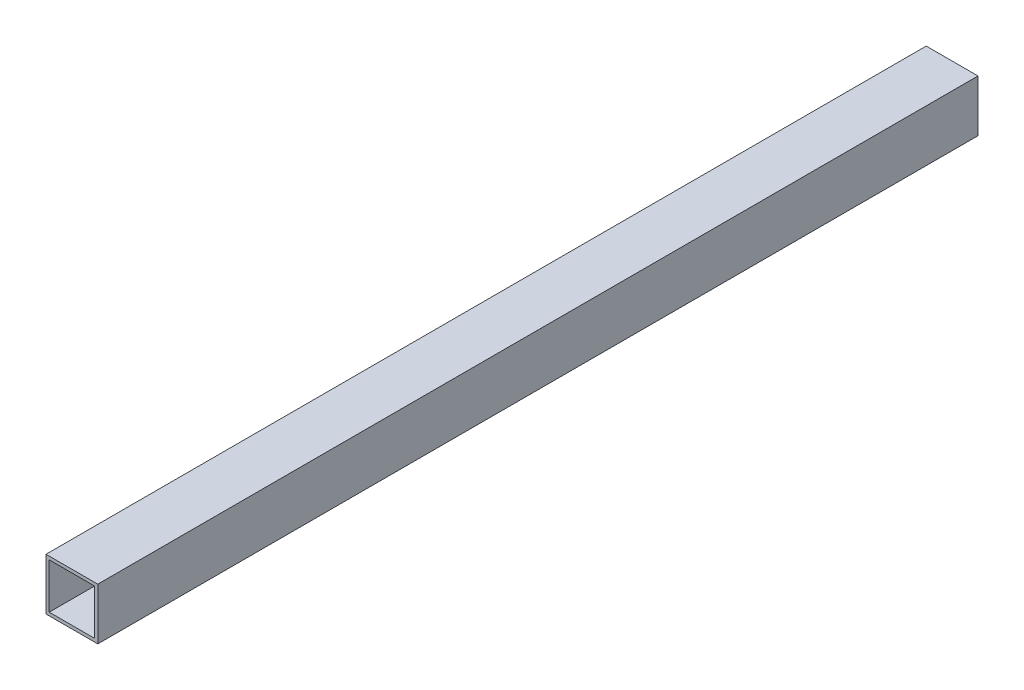
ISO-10303-21;
HEADER;
FILE_DESCRIPTION(('STEP AP214'),'2;1');
FILE_NAME('part.step','',(''),(''),'','','');
FILE_SCHEMA(('AUTOMOTIVE_DESIGN { 1 0 10303 214 1 1 1 1 }'));
ENDSEC;
DATA;
#1=APPLICATION_CONTEXT('core data for automotive mechanical design processes');
#2=APPLICATION_PROTOCOL_DEFINITION('international standard','automotive_design',2000,#1);
#3=PRODUCT_CONTEXT('',#1,'mechanical');
#4=PRODUCT('Part','Part','',(#3));
#5=PRODUCT_RELATED_PRODUCT_CATEGORY('part','',(#4));
#6=PRODUCT_DEFINITION_FORMATION('','',#4);
#7=PRODUCT_DEFINITION_CONTEXT('part definition',#1,'design');
#8=PRODUCT_DEFINITION('design','',#6,#7);
#9=PRODUCT_DEFINITION_SHAPE('','',#8);
#10=(LENGTH_UNIT() NAMED_UNIT(*) SI_UNIT(.MILLI.,.METRE.));
#11=(NAMED_UNIT(*) PLANE_ANGLE_UNIT() SI_UNIT($,.RADIAN.));
#12=(NAMED_UNIT(*) SI_UNIT($,.STERADIAN.) SOLID_ANGLE_UNIT());
#13=UNCERTAINTY_MEASURE_WITH_UNIT(LENGTH_MEASURE(1.E-05),#10,'distance_accuracy_value','');
#14=(GEOMETRIC_REPRESENTATION_CONTEXT(3) GLOBAL_UNCERTAINTY_ASSIGNED_CONTEXT((#13)) GLOBAL_UNIT_ASSIGNED_CONTEXT((#10,
#11,#12)) REPRESENTATION_CONTEXT('',''));
#15=CARTESIAN_POINT('',(0.,0.,0.));
#16=DIRECTION('',(0.,0.,1.));
#17=DIRECTION('',(1.,0.,0.));
#18=AXIS2_PLACEMENT_3D('',#15,#16,#17);
#19=CARTESIAN_POINT('',(25.4,25.4,863.6));
#20=DIRECTION('',(0.,0.,-1.));
#21=DIRECTION('',(-1.,0.,0.));
#22=AXIS2_PLACEMENT_3D('',#19,#20,#21);
#23=PLANE('',#22);
#24=DIRECTION('',(0.,1.,0.));
#25=VECTOR('',#24,1.);
#26=CARTESIAN_POINT('',(25.4,-25.4,863.6));
#27=LINE('',#26,#25);
#28=CARTESIAN_POINT('',(25.4,-25.4,863.6));
#29=VERTEX_POINT('',#28);
#30=CARTESIAN_POINT('',(25.4,25.4,863.6));
#31=VERTEX_POINT('',#30);
#32=EDGE_CURVE('E130',#29,#31,#27,.T.);
#33=ORIENTED_EDGE('',*,*,#32,.T.);
#34=DIRECTION('',(-1.,0.,0.));
#35=VECTOR('',#34,1.);
#36=CARTESIAN_POINT('',(-25.4,25.4,863.6));
#37=LINE('',#36,#35);
#38=CARTESIAN_POINT('',(-25.4,25.4,863.6));
#39=VERTEX_POINT('',#38);
#40=EDGE_CURVE('E133',#31,#39,#37,.T.);
#41=ORIENTED_EDGE('',*,*,#40,.T.);
#42=DIRECTION('',(0.,-1.,0.));
#43=VECTOR('',#42,1.);
#44=CARTESIAN_POINT('',(-25.4,-25.4,863.6));
#45=LINE('',#44,#43);
#46=CARTESIAN_POINT('',(-25.4,-25.4,863.6));
#47=VERTEX_POINT('',#46);
#48=EDGE_CURVE('E136',#39,#47,#45,.T.);
#49=ORIENTED_EDGE('',*,*,#48,.T.);
#50=DIRECTION('',(1.,0.,0.));
#51=VECTOR('',#50,1.);
#52=CARTESIAN_POINT('',(-25.4,-25.4,863.6));
#53=LINE('',#52,#51);
#54=EDGE_CURVE('E138',#47,#29,#53,.T.);
#55=ORIENTED_EDGE('',*,*,#54,.T.);
#56=EDGE_LOOP('',(#33,#41,#49,#55));
#57=FACE_BOUND('',#56,.T.);
#58=DIRECTION('',(0.,1.,0.));
#59=VECTOR('',#58,1.);
#60=CARTESIAN_POINT('',(22.225,25.4,863.6));
#61=LINE('',#60,#59);
#62=CARTESIAN_POINT('',(22.225,-22.225,863.6));
#63=VERTEX_POINT('',#62);
#64=CARTESIAN_POINT('',(22.225,22.225,863.6));
#65=VERTEX_POINT('',#64);
#66=EDGE_CURVE('E118',#63,#65,#61,.T.);
#67=ORIENTED_EDGE('',*,*,#66,.F.);
#68=DIRECTION('',(1.,0.,0.));
#69=VECTOR('',#68,1.);
#70=CARTESIAN_POINT('',(25.4,-22.225,863.6));
#71=LINE('',#70,#69);
#72=CARTESIAN_POINT('',(-22.225,-22.225,863.6));
#73=VERTEX_POINT('',#72);
#74=EDGE_CURVE('E103',#73,#63,#71,.T.);
#75=ORIENTED_EDGE('',*,*,#74,.F.);
#76=DIRECTION('',(0.,-1.,0.));
#77=VECTOR('',#76,1.);
#78=CARTESIAN_POINT('',(-22.225,25.4,863.6));
#79=LINE('',#78,#77);
#80=CARTESIAN_POINT('',(-22.225,22.225,863.6));
#81=VERTEX_POINT('',#80);
#82=EDGE_CURVE('E127',#81,#73,#79,.T.);
#83=ORIENTED_EDGE('',*,*,#82,.F.);
#84=DIRECTION('',(-1.,0.,0.));
#85=VECTOR('',#84,1.);
#86=CARTESIAN_POINT('',(25.4,22.225,863.6));
#87=LINE('',#86,#85);
#88=EDGE_CURVE('E120',#65,#81,#87,.T.);
#89=ORIENTED_EDGE('',*,*,#88,.F.);
#90=EDGE_LOOP('',(#67,#75,#83,#89));
#91=FACE_BOUND('',#90,.T.);
#92=ADVANCED_FACE('F33',(#57,#91),#23,.F.);
#93=CARTESIAN_POINT('',(25.4,25.4,0.));
#94=DIRECTION('',(0.,0.,-1.));
#95=DIRECTION('',(-1.,0.,0.));
#96=AXIS2_PLACEMENT_3D('',#93,#94,#95);
#97=PLANE('',#96);
#98=DIRECTION('',(0.,1.,0.));
#99=VECTOR('',#98,1.);
#100=CARTESIAN_POINT('',(25.4,-25.4,0.));
#101=LINE('',#100,#99);
#102=CARTESIAN_POINT('',(25.4,-25.4,0.));
#103=VERTEX_POINT('',#102);
#104=CARTESIAN_POINT('',(25.4,25.4,0.));
#105=VERTEX_POINT('',#104);
#106=EDGE_CURVE('E141',#103,#105,#101,.T.);
#107=ORIENTED_EDGE('',*,*,#106,.F.);
#108=DIRECTION('',(1.,0.,0.));
#109=VECTOR('',#108,1.);
#110=CARTESIAN_POINT('',(-25.4,-25.4,0.));
#111=LINE('',#110,#109);
#112=CARTESIAN_POINT('',(-25.4,-25.4,0.));
#113=VERTEX_POINT('',#112);
#114=EDGE_CURVE('E134',#113,#103,#111,.T.);
#115=ORIENTED_EDGE('',*,*,#114,.F.);
#116=DIRECTION('',(0.,-1.,0.));
#117=VECTOR('',#116,1.);
#118=CARTESIAN_POINT('',(-25.4,-25.4,0.));
#119=LINE('',#118,#117);
#120=CARTESIAN_POINT('',(-25.4,25.4,0.));
#121=VERTEX_POINT('',#120);
#122=EDGE_CURVE('E146',#121,#113,#119,.T.);
#123=ORIENTED_EDGE('',*,*,#122,.F.);
#124=DIRECTION('',(-1.,0.,0.));
#125=VECTOR('',#124,1.);
#126=CARTESIAN_POINT('',(-25.4,25.4,0.));
#127=LINE('',#126,#125);
#128=EDGE_CURVE('E144',#105,#121,#127,.T.);
#129=ORIENTED_EDGE('',*,*,#128,.F.);
#130=EDGE_LOOP('',(#107,#115,#123,#129));
#131=FACE_BOUND('',#130,.T.);
#132=DIRECTION('',(1.,0.,0.));
#133=VECTOR('',#132,1.);
#134=CARTESIAN_POINT('',(25.4,-22.225,0.));
#135=LINE('',#134,#133);
#136=CARTESIAN_POINT('',(-22.225,-22.225,0.));
#137=VERTEX_POINT('',#136);
#138=CARTESIAN_POINT('',(22.225,-22.225,0.));
#139=VERTEX_POINT('',#138);
#140=EDGE_CURVE('E101',#137,#139,#135,.T.);
#141=ORIENTED_EDGE('',*,*,#140,.T.);
#142=DIRECTION('',(0.,1.,0.));
#143=VECTOR('',#142,1.);
#144=CARTESIAN_POINT('',(22.225,25.4,0.));
#145=LINE('',#144,#143);
#146=CARTESIAN_POINT('',(22.225,22.225,0.));
#147=VERTEX_POINT('',#146);
#148=EDGE_CURVE('E109',#139,#147,#145,.T.);
#149=ORIENTED_EDGE('',*,*,#148,.T.);
#150=DIRECTION('',(-1.,0.,0.));
#151=VECTOR('',#150,1.);
#152=CARTESIAN_POINT('',(25.4,22.225,0.));
#153=LINE('',#152,#151);
#154=CARTESIAN_POINT('',(-22.225,22.225,0.));
#155=VERTEX_POINT('',#154);
#156=EDGE_CURVE('E115',#147,#155,#153,.T.);
#157=ORIENTED_EDGE('',*,*,#156,.T.);
#158=DIRECTION('',(0.,-1.,0.));
#159=VECTOR('',#158,1.);
#160=CARTESIAN_POINT('',(-22.225,25.4,0.));
#161=LINE('',#160,#159);
#162=EDGE_CURVE('E55',#155,#137,#161,.T.);
#163=ORIENTED_EDGE('',*,*,#162,.T.);
#164=EDGE_LOOP('',(#141,#149,#157,#163));
#165=FACE_BOUND('',#164,.T.);
#166=ADVANCED_FACE('F117',(#131,#165),#97,.T.);
#167=CARTESIAN_POINT('',(25.4,-25.4,863.6));
#168=DIRECTION('',(-1.,0.,0.));
#169=DIRECTION('',(0.,0.,1.));
#170=AXIS2_PLACEMENT_3D('',#167,#168,#169);
#171=PLANE('',#170);
#172=ORIENTED_EDGE('',*,*,#106,.T.);
#173=DIRECTION('',(0.,0.,-1.));
#174=VECTOR('',#173,1.);
#175=CARTESIAN_POINT('',(25.4,25.4,863.6));
#176=LINE('',#175,#174);
#177=EDGE_CURVE('E11',#31,#105,#176,.T.);
#178=ORIENTED_EDGE('',*,*,#177,.F.);
#179=ORIENTED_EDGE('',*,*,#32,.F.);
#180=DIRECTION('',(0.,0.,-1.));
#181=VECTOR('',#180,1.);
#182=CARTESIAN_POINT('',(25.4,-25.4,863.6));
#183=LINE('',#182,#181);
#184=EDGE_CURVE('E140',#29,#103,#183,.T.);
#185=ORIENTED_EDGE('',*,*,#184,.T.);
#186=EDGE_LOOP('',(#172,#178,#179,#185));
#187=FACE_BOUND('',#186,.T.);
#188=ADVANCED_FACE('F35',(#187),#171,.F.);
#189=CARTESIAN_POINT('',(-25.4,25.4,863.6));
#190=DIRECTION('',(0.,-1.,0.));
#191=DIRECTION('',(0.,0.,-1.));
#192=AXIS2_PLACEMENT_3D('',#189,#190,#191);
#193=PLANE('',#192);
#194=ORIENTED_EDGE('',*,*,#128,.T.);
#195=DIRECTION('',(0.,0.,-1.));
#196=VECTOR('',#195,1.);
#197=CARTESIAN_POINT('',(-25.4,25.4,863.6));
#198=LINE('',#197,#196);
#199=EDGE_CURVE('E41',#39,#121,#198,.T.);
#200=ORIENTED_EDGE('',*,*,#199,.F.);
#201=ORIENTED_EDGE('',*,*,#40,.F.);
#202=ORIENTED_EDGE('',*,*,#177,.T.);
#203=EDGE_LOOP('',(#194,#200,#201,#202));
#204=FACE_BOUND('',#203,.T.);
#205=ADVANCED_FACE('F173',(#204),#193,.F.);
#206=CARTESIAN_POINT('',(-25.4,-25.4,863.6));
#207=DIRECTION('',(1.,0.,0.));
#208=DIRECTION('',(0.,0.,-1.));
#209=AXIS2_PLACEMENT_3D('',#206,#207,#208);
#210=PLANE('',#209);
#211=ORIENTED_EDGE('',*,*,#122,.T.);
#212=DIRECTION('',(0.,0.,-1.));
#213=VECTOR('',#212,1.);
#214=CARTESIAN_POINT('',(-25.4,-25.4,863.6));
#215=LINE('',#214,#213);
#216=EDGE_CURVE('E151',#47,#113,#215,.T.);
#217=ORIENTED_EDGE('',*,*,#216,.F.);
#218=ORIENTED_EDGE('',*,*,#48,.F.);
#219=ORIENTED_EDGE('',*,*,#199,.T.);
#220=EDGE_LOOP('',(#211,#217,#218,#219));
#221=FACE_BOUND('',#220,.T.);
#222=ADVANCED_FACE('F158',(#221),#210,.F.);
#223=CARTESIAN_POINT('',(-25.4,-25.4,863.6));
#224=DIRECTION('',(0.,1.,0.));
#225=DIRECTION('',(0.,0.,1.));
#226=AXIS2_PLACEMENT_3D('',#223,#224,#225);
#227=PLANE('',#226);
#228=ORIENTED_EDGE('',*,*,#114,.T.);
#229=ORIENTED_EDGE('',*,*,#184,.F.);
#230=ORIENTED_EDGE('',*,*,#54,.F.);
#231=ORIENTED_EDGE('',*,*,#216,.T.);
#232=EDGE_LOOP('',(#228,#229,#230,#231));
#233=FACE_BOUND('',#232,.T.);
#234=ADVANCED_FACE('F166',(#233),#227,.F.);
#235=CARTESIAN_POINT('',(22.225,-25.4,863.6));
#236=DIRECTION('',(-1.,0.,0.));
#237=DIRECTION('',(0.,0.,1.));
#238=AXIS2_PLACEMENT_3D('',#235,#236,#237);
#239=PLANE('',#238);
#240=ORIENTED_EDGE('',*,*,#148,.F.);
#241=DIRECTION('',(0.,0.,-1.));
#242=VECTOR('',#241,1.);
#243=CARTESIAN_POINT('',(22.225,-22.225,863.6));
#244=LINE('',#243,#242);
#245=EDGE_CURVE('E97',#63,#139,#244,.T.);
#246=ORIENTED_EDGE('',*,*,#245,.F.);
#247=ORIENTED_EDGE('',*,*,#66,.T.);
#248=DIRECTION('',(0.,0.,-1.));
#249=VECTOR('',#248,1.);
#250=CARTESIAN_POINT('',(22.225,22.225,863.6));
#251=LINE('',#250,#249);
#252=EDGE_CURVE('E112',#65,#147,#251,.T.);
#253=ORIENTED_EDGE('',*,*,#252,.T.);
#254=EDGE_LOOP('',(#240,#246,#247,#253));
#255=FACE_BOUND('',#254,.T.);
#256=ADVANCED_FACE('F110',(#255),#239,.T.);
#257=CARTESIAN_POINT('',(-25.4,22.225,863.6));
#258=DIRECTION('',(0.,-1.,0.));
#259=DIRECTION('',(0.,0.,-1.));
#260=AXIS2_PLACEMENT_3D('',#257,#258,#259);
#261=PLANE('',#260);
#262=ORIENTED_EDGE('',*,*,#156,.F.);
#263=ORIENTED_EDGE('',*,*,#252,.F.);
#264=ORIENTED_EDGE('',*,*,#88,.T.);
#265=DIRECTION('',(0.,0.,-1.));
#266=VECTOR('',#265,1.);
#267=CARTESIAN_POINT('',(-22.225,22.225,863.6));
#268=LINE('',#267,#266);
#269=EDGE_CURVE('E256',#81,#155,#268,.T.);
#270=ORIENTED_EDGE('',*,*,#269,.T.);
#271=EDGE_LOOP('',(#262,#263,#264,#270));
#272=FACE_BOUND('',#271,.T.);
#273=ADVANCED_FACE('F193',(#272),#261,.T.);
#274=CARTESIAN_POINT('',(-22.225,-25.4,863.6));
#275=DIRECTION('',(1.,0.,0.));
#276=DIRECTION('',(0.,0.,-1.));
#277=AXIS2_PLACEMENT_3D('',#274,#275,#276);
#278=PLANE('',#277);
#279=ORIENTED_EDGE('',*,*,#162,.F.);
#280=ORIENTED_EDGE('',*,*,#269,.F.);
#281=ORIENTED_EDGE('',*,*,#82,.T.);
#282=DIRECTION('',(0.,0.,-1.));
#283=VECTOR('',#282,1.);
#284=CARTESIAN_POINT('',(-22.225,-22.225,863.6));
#285=LINE('',#284,#283);
#286=EDGE_CURVE('E48',#73,#137,#285,.T.);
#287=ORIENTED_EDGE('',*,*,#286,.T.);
#288=EDGE_LOOP('',(#279,#280,#281,#287));
#289=FACE_BOUND('',#288,.T.);
#290=ADVANCED_FACE('F198',(#289),#278,.T.);
#291=CARTESIAN_POINT('',(-25.4,-22.225,863.6));
#292=DIRECTION('',(0.,1.,0.));
#293=DIRECTION('',(0.,0.,1.));
#294=AXIS2_PLACEMENT_3D('',#291,#292,#293);
#295=PLANE('',#294);
#296=ORIENTED_EDGE('',*,*,#140,.F.);
#297=ORIENTED_EDGE('',*,*,#286,.F.);
#298=ORIENTED_EDGE('',*,*,#74,.T.);
#299=ORIENTED_EDGE('',*,*,#245,.T.);
#300=EDGE_LOOP('',(#296,#297,#298,#299));
#301=FACE_BOUND('',#300,.T.);
#302=ADVANCED_FACE('F99',(#301),#295,.T.);
#303=CLOSED_SHELL('',(#92,#166,#188,#205,#222,#234,#256,#273,#290,#302));
#304=MANIFOLD_SOLID_BREP('B2',#303);
#305=ADVANCED_BREP_SHAPE_REPRESENTATION('',(#18,#304),#14);
#306=SHAPE_DEFINITION_REPRESENTATION(#9,#305);
ENDSEC;
END-ISO-10303-21;
